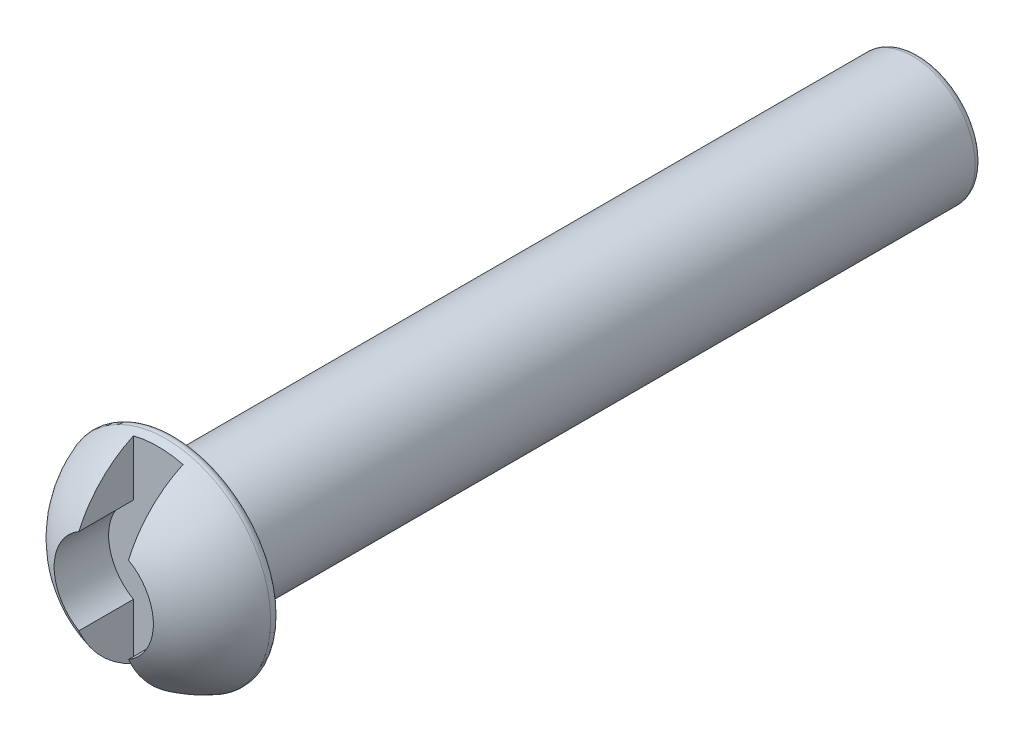
ISO-10303-21;
HEADER;
FILE_DESCRIPTION(('STEP AP214'),'2;1');
FILE_NAME('part.step','',(''),(''),'','','');
FILE_SCHEMA(('AUTOMOTIVE_DESIGN { 1 0 10303 214 1 1 1 1 }'));
ENDSEC;
DATA;
#1=APPLICATION_CONTEXT('core data for automotive mechanical design processes');
#2=APPLICATION_PROTOCOL_DEFINITION('international standard','automotive_design',2000,#1);
#3=PRODUCT_CONTEXT('',#1,'mechanical');
#4=PRODUCT('Part','Part','',(#3));
#5=PRODUCT_RELATED_PRODUCT_CATEGORY('part','',(#4));
#6=PRODUCT_DEFINITION_FORMATION('','',#4);
#7=PRODUCT_DEFINITION_CONTEXT('part definition',#1,'design');
#8=PRODUCT_DEFINITION('design','',#6,#7);
#9=PRODUCT_DEFINITION_SHAPE('','',#8);
#10=(LENGTH_UNIT() NAMED_UNIT(*) SI_UNIT(.MILLI.,.METRE.));
#11=(NAMED_UNIT(*) PLANE_ANGLE_UNIT() SI_UNIT($,.RADIAN.));
#12=(NAMED_UNIT(*) SI_UNIT($,.STERADIAN.) SOLID_ANGLE_UNIT());
#13=UNCERTAINTY_MEASURE_WITH_UNIT(LENGTH_MEASURE(1.E-05),#10,'distance_accuracy_value','');
#14=(GEOMETRIC_REPRESENTATION_CONTEXT(3) GLOBAL_UNCERTAINTY_ASSIGNED_CONTEXT((#13)) GLOBAL_UNIT_ASSIGNED_CONTEXT((#10,
#11,#12)) REPRESENTATION_CONTEXT('',''));
#15=CARTESIAN_POINT('',(0.,0.,0.));
#16=DIRECTION('',(0.,0.,1.));
#17=DIRECTION('',(1.,0.,0.));
#18=AXIS2_PLACEMENT_3D('',#15,#16,#17);
#19=CARTESIAN_POINT('',(0.,0.,-1.68125));
#20=DIRECTION('',(0.,0.,1.));
#21=DIRECTION('',(0.,1.,0.));
#22=AXIS2_PLACEMENT_3D('',#19,#20,#21);
#23=SPHERICAL_SURFACE('',#22,1.68125);
#24=CARTESIAN_POINT('',(0.,0.,-1.11640316205534));
#25=DIRECTION('',(0.,0.,-1.));
#26=DIRECTION('',(-1.,0.,0.));
#27=AXIS2_PLACEMENT_3D('',#24,#25,#26);
#28=CIRCLE('',#27,1.58352442739729);
#29=CARTESIAN_POINT('',(-1.58352442739729,0.,-1.11640316205534));
#30=VERTEX_POINT('',#29);
#31=EDGE_CURVE('E40',#30,#30,#28,.F.);
#32=ORIENTED_EDGE('',*,*,#31,.T.);
#33=EDGE_LOOP('',(#32));
#34=FACE_BOUND('',#33,.T.);
#35=CARTESIAN_POINT('',(-0.375,0.,-1.68125));
#36=DIRECTION('',(-1.,0.,0.));
#37=DIRECTION('',(0.,0.,1.));
#38=AXIS2_PLACEMENT_3D('',#35,#36,#37);
#39=CIRCLE('',#38,1.63889492112826);
#40=CARTESIAN_POINT('',(-0.375,-1.49059551857638,-1.));
#41=VERTEX_POINT('',#40);
#42=CARTESIAN_POINT('',(-0.375,-0.649519052838329,-0.176556821142596));
#43=VERTEX_POINT('',#42);
#44=EDGE_CURVE('E126',#41,#43,#39,.T.);
#45=ORIENTED_EDGE('',*,*,#44,.T.);
#46=CARTESIAN_POINT('',(0.,0.,-0.176556821142596));
#47=DIRECTION('',(0.,0.,-1.));
#48=DIRECTION('',(-1.,0.,0.));
#49=AXIS2_PLACEMENT_3D('',#46,#47,#48);
#50=CIRCLE('',#49,0.75);
#51=CARTESIAN_POINT('',(-0.375,0.649519052838329,-0.176556821142596));
#52=VERTEX_POINT('',#51);
#53=EDGE_CURVE('E137',#43,#52,#50,.T.);
#54=ORIENTED_EDGE('',*,*,#53,.T.);
#55=CARTESIAN_POINT('',(-0.375,0.,-1.68125));
#56=DIRECTION('',(-1.,0.,0.));
#57=DIRECTION('',(0.,0.,1.));
#58=AXIS2_PLACEMENT_3D('',#55,#56,#57);
#59=CIRCLE('',#58,1.63889492112826);
#60=CARTESIAN_POINT('',(-0.375,1.49059551857638,-1.));
#61=VERTEX_POINT('',#60);
#62=EDGE_CURVE('E99',#52,#61,#59,.T.);
#63=ORIENTED_EDGE('',*,*,#62,.T.);
#64=CARTESIAN_POINT('',(0.,0.,-1.));
#65=DIRECTION('',(0.,0.,1.));
#66=DIRECTION('',(1.,0.,0.));
#67=AXIS2_PLACEMENT_3D('',#64,#65,#66);
#68=CIRCLE('',#67,1.53704261489394);
#69=CARTESIAN_POINT('',(0.375,1.49059551857638,-1.));
#70=VERTEX_POINT('',#69);
#71=EDGE_CURVE('E92',#70,#61,#68,.T.);
#72=ORIENTED_EDGE('',*,*,#71,.F.);
#73=CARTESIAN_POINT('',(0.375,0.,-1.68125));
#74=DIRECTION('',(1.,0.,0.));
#75=DIRECTION('',(0.,0.,-1.));
#76=AXIS2_PLACEMENT_3D('',#73,#74,#75);
#77=CIRCLE('',#76,1.63889492112826);
#78=CARTESIAN_POINT('',(0.375,0.649519052838329,-0.176556821142596));
#79=VERTEX_POINT('',#78);
#80=EDGE_CURVE('E133',#70,#79,#77,.T.);
#81=ORIENTED_EDGE('',*,*,#80,.T.);
#82=CARTESIAN_POINT('',(0.,0.,-0.176556821142596));
#83=DIRECTION('',(0.,0.,-1.));
#84=DIRECTION('',(-1.,0.,0.));
#85=AXIS2_PLACEMENT_3D('',#82,#83,#84);
#86=CIRCLE('',#85,0.75);
#87=CARTESIAN_POINT('',(0.375,-0.649519052838329,-0.176556821142596));
#88=VERTEX_POINT('',#87);
#89=EDGE_CURVE('E55',#79,#88,#86,.T.);
#90=ORIENTED_EDGE('',*,*,#89,.T.);
#91=CARTESIAN_POINT('',(0.375,0.,-1.68125));
#92=DIRECTION('',(1.,0.,0.));
#93=DIRECTION('',(0.,0.,-1.));
#94=AXIS2_PLACEMENT_3D('',#91,#92,#93);
#95=CIRCLE('',#94,1.63889492112826);
#96=CARTESIAN_POINT('',(0.375,-1.49059551857638,-1.));
#97=VERTEX_POINT('',#96);
#98=EDGE_CURVE('E129',#88,#97,#95,.T.);
#99=ORIENTED_EDGE('',*,*,#98,.T.);
#100=EDGE_CURVE('E124',#41,#97,#68,.T.);
#101=ORIENTED_EDGE('',*,*,#100,.F.);
#102=EDGE_LOOP('',(#45,#54,#63,#72,#81,#90,#99,#101));
#103=FACE_BOUND('',#102,.T.);
#104=ADVANCED_FACE('F32',(#34,#103),#23,.T.);
#105=CARTESIAN_POINT('',(0.,0.949999999999999,-1.25));
#106=DIRECTION('',(0.,0.,1.));
#107=DIRECTION('',(1.,0.,0.));
#108=AXIS2_PLACEMENT_3D('',#105,#106,#107);
#109=PLANE('',#108);
#110=CARTESIAN_POINT('',(0.,0.,-1.25));
#111=DIRECTION('',(0.,0.,1.));
#112=DIRECTION('',(1.,0.,0.));
#113=AXIS2_PLACEMENT_3D('',#110,#111,#112);
#114=CIRCLE('',#113,1.48933710086065);
#115=CARTESIAN_POINT('',(1.48933710086065,0.,-1.25));
#116=VERTEX_POINT('',#115);
#117=EDGE_CURVE('E11',#116,#116,#114,.F.);
#118=ORIENTED_EDGE('',*,*,#117,.T.);
#119=EDGE_LOOP('',(#118));
#120=FACE_BOUND('',#119,.T.);
#121=CARTESIAN_POINT('',(0.,0.,-1.25));
#122=DIRECTION('',(0.,0.,1.));
#123=DIRECTION('',(1.,0.,0.));
#124=AXIS2_PLACEMENT_3D('',#121,#122,#123);
#125=CIRCLE('',#124,0.949999999999999);
#126=CARTESIAN_POINT('',(0.949999999999999,0.,-1.25));
#127=VERTEX_POINT('',#126);
#128=EDGE_CURVE('E118',#127,#127,#125,.T.);
#129=ORIENTED_EDGE('',*,*,#128,.T.);
#130=EDGE_LOOP('',(#129));
#131=FACE_BOUND('',#130,.T.);
#132=ADVANCED_FACE('F158',(#120,#131),#109,.F.);
#133=CARTESIAN_POINT('',(0.,0.,0.));
#134=DIRECTION('',(0.,0.,1.));
#135=DIRECTION('',(1.,0.,0.));
#136=AXIS2_PLACEMENT_3D('',#133,#134,#135);
#137=CYLINDRICAL_SURFACE('',#136,0.95);
#138=CARTESIAN_POINT('',(0.,0.,-12.4));
#139=DIRECTION('',(0.,0.,1.));
#140=DIRECTION('',(1.,0.,0.));
#141=AXIS2_PLACEMENT_3D('',#138,#139,#140);
#142=CIRCLE('',#141,0.95);
#143=CARTESIAN_POINT('',(0.95,0.,-12.4));
#144=VERTEX_POINT('',#143);
#145=EDGE_CURVE('E139',#144,#144,#142,.T.);
#146=ORIENTED_EDGE('',*,*,#145,.T.);
#147=EDGE_LOOP('',(#146));
#148=FACE_BOUND('',#147,.T.);
#149=ORIENTED_EDGE('',*,*,#128,.F.);
#150=EDGE_LOOP('',(#149));
#151=FACE_BOUND('',#150,.T.);
#152=ADVANCED_FACE('F163',(#148,#151),#137,.T.);
#153=CARTESIAN_POINT('',(0.,0.,-12.5));
#154=DIRECTION('',(0.,0.,1.));
#155=DIRECTION('',(1.,0.,0.));
#156=AXIS2_PLACEMENT_3D('',#153,#154,#155);
#157=PLANE('',#156);
#158=CARTESIAN_POINT('',(0.,0.,-12.5));
#159=DIRECTION('',(0.,0.,1.));
#160=DIRECTION('',(1.,0.,0.));
#161=AXIS2_PLACEMENT_3D('',#158,#159,#160);
#162=CIRCLE('',#161,0.849999999999999);
#163=CARTESIAN_POINT('',(0.849999999999999,0.,-12.5));
#164=VERTEX_POINT('',#163);
#165=EDGE_CURVE('E142',#164,#164,#162,.F.);
#166=ORIENTED_EDGE('',*,*,#165,.T.);
#167=EDGE_LOOP('',(#166));
#168=FACE_BOUND('',#167,.T.);
#169=ADVANCED_FACE('F169',(#168),#157,.F.);
#170=CARTESIAN_POINT('',(0.375,0.649519052838329,-1.));
#171=DIRECTION('',(1.,0.,0.));
#172=DIRECTION('',(0.,0.,-1.));
#173=AXIS2_PLACEMENT_3D('',#170,#171,#172);
#174=PLANE('',#173);
#175=DIRECTION('',(0.,1.,0.));
#176=VECTOR('',#175,1.);
#177=CARTESIAN_POINT('',(0.375,0.649519052838329,-1.));
#178=LINE('',#177,#176);
#179=CARTESIAN_POINT('',(0.375,0.649519052838329,-1.));
#180=VERTEX_POINT('',#179);
#181=EDGE_CURVE('E103',#180,#70,#178,.T.);
#182=ORIENTED_EDGE('',*,*,#181,.F.);
#183=DIRECTION('',(0.,0.,1.));
#184=VECTOR('',#183,1.);
#185=CARTESIAN_POINT('',(0.375,0.649519052838329,-1.));
#186=LINE('',#185,#184);
#187=EDGE_CURVE('E116',#180,#79,#186,.T.);
#188=ORIENTED_EDGE('',*,*,#187,.T.);
#189=ORIENTED_EDGE('',*,*,#80,.F.);
#190=EDGE_LOOP('',(#182,#188,#189));
#191=FACE_BOUND('',#190,.T.);
#192=ADVANCED_FACE('F173',(#191),#174,.F.);
#193=CARTESIAN_POINT('',(0.,0.,-1.));
#194=DIRECTION('',(0.,0.,1.));
#195=DIRECTION('',(1.,0.,0.));
#196=AXIS2_PLACEMENT_3D('',#193,#194,#195);
#197=CYLINDRICAL_SURFACE('',#196,0.75);
#198=ORIENTED_EDGE('',*,*,#187,.F.);
#199=CARTESIAN_POINT('',(0.,0.,-1.));
#200=DIRECTION('',(0.,0.,1.));
#201=DIRECTION('',(1.,0.,0.));
#202=AXIS2_PLACEMENT_3D('',#199,#200,#201);
#203=CIRCLE('',#202,0.75);
#204=CARTESIAN_POINT('',(0.375,-0.649519052838329,-1.));
#205=VERTEX_POINT('',#204);
#206=EDGE_CURVE('E112',#205,#180,#203,.T.);
#207=ORIENTED_EDGE('',*,*,#206,.F.);
#208=DIRECTION('',(0.,0.,1.));
#209=VECTOR('',#208,1.);
#210=CARTESIAN_POINT('',(0.375,-0.649519052838329,-1.));
#211=LINE('',#210,#209);
#212=EDGE_CURVE('E119',#205,#88,#211,.T.);
#213=ORIENTED_EDGE('',*,*,#212,.T.);
#214=ORIENTED_EDGE('',*,*,#89,.F.);
#215=EDGE_LOOP('',(#198,#207,#213,#214));
#216=FACE_BOUND('',#215,.T.);
#217=ADVANCED_FACE('F186',(#216),#197,.F.);
#218=CARTESIAN_POINT('',(0.375,-2.04677330454303,-1.));
#219=DIRECTION('',(1.,0.,0.));
#220=DIRECTION('',(0.,0.,-1.));
#221=AXIS2_PLACEMENT_3D('',#218,#219,#220);
#222=PLANE('',#221);
#223=ORIENTED_EDGE('',*,*,#212,.F.);
#224=DIRECTION('',(0.,1.,0.));
#225=VECTOR('',#224,1.);
#226=CARTESIAN_POINT('',(0.375,-2.04677330454303,-1.));
#227=LINE('',#226,#225);
#228=EDGE_CURVE('E108',#97,#205,#227,.T.);
#229=ORIENTED_EDGE('',*,*,#228,.F.);
#230=ORIENTED_EDGE('',*,*,#98,.F.);
#231=EDGE_LOOP('',(#223,#229,#230));
#232=FACE_BOUND('',#231,.T.);
#233=ADVANCED_FACE('F182',(#232),#222,.F.);
#234=CARTESIAN_POINT('',(-0.375,-2.04677330454303,-1.));
#235=DIRECTION('',(-1.,0.,0.));
#236=DIRECTION('',(0.,0.,1.));
#237=AXIS2_PLACEMENT_3D('',#234,#235,#236);
#238=PLANE('',#237);
#239=DIRECTION('',(0.,-1.,0.));
#240=VECTOR('',#239,1.);
#241=CARTESIAN_POINT('',(-0.375,-2.04677330454303,-1.));
#242=LINE('',#241,#240);
#243=CARTESIAN_POINT('',(-0.375,-0.649519052838329,-1.));
#244=VERTEX_POINT('',#243);
#245=EDGE_CURVE('E47',#244,#41,#242,.T.);
#246=ORIENTED_EDGE('',*,*,#245,.F.);
#247=DIRECTION('',(0.,0.,1.));
#248=VECTOR('',#247,1.);
#249=CARTESIAN_POINT('',(-0.375,-0.649519052838329,-1.));
#250=LINE('',#249,#248);
#251=EDGE_CURVE('E102',#244,#43,#250,.T.);
#252=ORIENTED_EDGE('',*,*,#251,.T.);
#253=ORIENTED_EDGE('',*,*,#44,.F.);
#254=EDGE_LOOP('',(#246,#252,#253));
#255=FACE_BOUND('',#254,.T.);
#256=ADVANCED_FACE('F179',(#255),#238,.F.);
#257=CARTESIAN_POINT('',(0.,0.,-1.));
#258=DIRECTION('',(0.,0.,1.));
#259=DIRECTION('',(1.,0.,0.));
#260=AXIS2_PLACEMENT_3D('',#257,#258,#259);
#261=CYLINDRICAL_SURFACE('',#260,0.75);
#262=ORIENTED_EDGE('',*,*,#251,.F.);
#263=CARTESIAN_POINT('',(0.,0.,-1.));
#264=DIRECTION('',(0.,0.,1.));
#265=DIRECTION('',(1.,0.,0.));
#266=AXIS2_PLACEMENT_3D('',#263,#264,#265);
#267=CIRCLE('',#266,0.75);
#268=CARTESIAN_POINT('',(-0.375,0.649519052838329,-1.));
#269=VERTEX_POINT('',#268);
#270=EDGE_CURVE('E89',#269,#244,#267,.T.);
#271=ORIENTED_EDGE('',*,*,#270,.F.);
#272=DIRECTION('',(0.,0.,1.));
#273=VECTOR('',#272,1.);
#274=CARTESIAN_POINT('',(-0.375,0.649519052838329,-1.));
#275=LINE('',#274,#273);
#276=EDGE_CURVE('E97',#269,#52,#275,.T.);
#277=ORIENTED_EDGE('',*,*,#276,.T.);
#278=ORIENTED_EDGE('',*,*,#53,.F.);
#279=EDGE_LOOP('',(#262,#271,#277,#278));
#280=FACE_BOUND('',#279,.T.);
#281=ADVANCED_FACE('F105',(#280),#261,.F.);
#282=CARTESIAN_POINT('',(-0.375,0.649519052838329,-1.));
#283=DIRECTION('',(-1.,0.,0.));
#284=DIRECTION('',(0.,0.,1.));
#285=AXIS2_PLACEMENT_3D('',#282,#283,#284);
#286=PLANE('',#285);
#287=ORIENTED_EDGE('',*,*,#276,.F.);
#288=DIRECTION('',(0.,-1.,0.));
#289=VECTOR('',#288,1.);
#290=CARTESIAN_POINT('',(-0.375,0.649519052838329,-1.));
#291=LINE('',#290,#289);
#292=EDGE_CURVE('E85',#61,#269,#291,.T.);
#293=ORIENTED_EDGE('',*,*,#292,.F.);
#294=ORIENTED_EDGE('',*,*,#62,.F.);
#295=EDGE_LOOP('',(#287,#293,#294));
#296=FACE_BOUND('',#295,.T.);
#297=ADVANCED_FACE('F98',(#296),#286,.F.);
#298=CARTESIAN_POINT('',(0.,0.,-1.));
#299=DIRECTION('',(0.,0.,1.));
#300=DIRECTION('',(1.,0.,0.));
#301=AXIS2_PLACEMENT_3D('',#298,#299,#300);
#302=PLANE('',#301);
#303=ORIENTED_EDGE('',*,*,#71,.T.);
#304=ORIENTED_EDGE('',*,*,#292,.T.);
#305=ORIENTED_EDGE('',*,*,#270,.T.);
#306=ORIENTED_EDGE('',*,*,#245,.T.);
#307=ORIENTED_EDGE('',*,*,#100,.T.);
#308=ORIENTED_EDGE('',*,*,#228,.T.);
#309=ORIENTED_EDGE('',*,*,#206,.T.);
#310=ORIENTED_EDGE('',*,*,#181,.T.);
#311=EDGE_LOOP('',(#303,#304,#305,#306,#307,#308,#309,#310));
#312=FACE_BOUND('',#311,.T.);
#313=ADVANCED_FACE('F87',(#312),#302,.T.);
#314=CARTESIAN_POINT('',(0.,0.,-12.4));
#315=DIRECTION('',(0.,0.,1.));
#316=DIRECTION('',(1.,0.,0.));
#317=AXIS2_PLACEMENT_3D('',#314,#315,#316);
#318=TOROIDAL_SURFACE('',#317,0.849999999999999,0.1);
#319=ORIENTED_EDGE('',*,*,#165,.F.);
#320=EDGE_LOOP('',(#319));
#321=FACE_BOUND('',#320,.T.);
#322=ORIENTED_EDGE('',*,*,#145,.F.);
#323=EDGE_LOOP('',(#322));
#324=FACE_BOUND('',#323,.T.);
#325=ADVANCED_FACE('F150',(#321,#324),#318,.T.);
#326=CARTESIAN_POINT('',(0.,0.,-1.15));
#327=DIRECTION('',(0.,0.,1.));
#328=DIRECTION('',(1.,0.,0.));
#329=AXIS2_PLACEMENT_3D('',#326,#327,#328);
#330=TOROIDAL_SURFACE('',#329,1.48933710086065,0.1);
#331=ORIENTED_EDGE('',*,*,#117,.F.);
#332=EDGE_LOOP('',(#331));
#333=FACE_BOUND('',#332,.T.);
#334=ORIENTED_EDGE('',*,*,#31,.F.);
#335=EDGE_LOOP('',(#334));
#336=FACE_BOUND('',#335,.T.);
#337=ADVANCED_FACE('F34',(#333,#336),#330,.T.);
#338=CLOSED_SHELL('',(#104,#132,#152,#169,#192,#217,#233,#256,#281,#297,#313,#325,#337));
#339=MANIFOLD_SOLID_BREP('B2',#338);
#340=ADVANCED_BREP_SHAPE_REPRESENTATION('',(#18,#339),#14);
#341=SHAPE_DEFINITION_REPRESENTATION(#9,#340);
ENDSEC;
END-ISO-10303-21;
